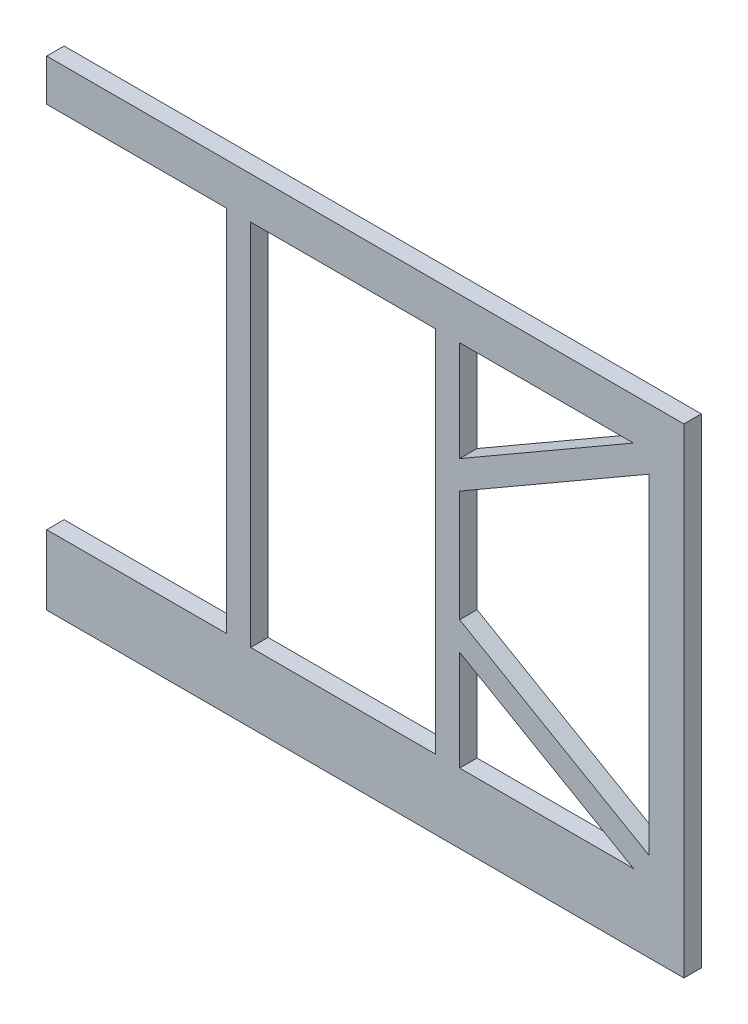
ISO-10303-21;
HEADER;
FILE_DESCRIPTION(('STEP AP214'),'2;1');
FILE_NAME('part.step','',(''),(''),'','','');
FILE_SCHEMA(('AUTOMOTIVE_DESIGN { 1 0 10303 214 1 1 1 1 }'));
ENDSEC;
DATA;
#1=APPLICATION_CONTEXT('core data for automotive mechanical design processes');
#2=APPLICATION_PROTOCOL_DEFINITION('international standard','automotive_design',2000,#1);
#3=PRODUCT_CONTEXT('',#1,'mechanical');
#4=PRODUCT('Part','Part','',(#3));
#5=PRODUCT_RELATED_PRODUCT_CATEGORY('part','',(#4));
#6=PRODUCT_DEFINITION_FORMATION('','',#4);
#7=PRODUCT_DEFINITION_CONTEXT('part definition',#1,'design');
#8=PRODUCT_DEFINITION('design','',#6,#7);
#9=PRODUCT_DEFINITION_SHAPE('','',#8);
#10=(LENGTH_UNIT() NAMED_UNIT(*) SI_UNIT(.MILLI.,.METRE.));
#11=(NAMED_UNIT(*) PLANE_ANGLE_UNIT() SI_UNIT($,.RADIAN.));
#12=(NAMED_UNIT(*) SI_UNIT($,.STERADIAN.) SOLID_ANGLE_UNIT());
#13=UNCERTAINTY_MEASURE_WITH_UNIT(LENGTH_MEASURE(1.E-05),#10,'distance_accuracy_value','');
#14=(GEOMETRIC_REPRESENTATION_CONTEXT(3) GLOBAL_UNCERTAINTY_ASSIGNED_CONTEXT((#13)) GLOBAL_UNIT_ASSIGNED_CONTEXT((#10,
#11,#12)) REPRESENTATION_CONTEXT('',''));
#15=CARTESIAN_POINT('',(0.,0.,0.));
#16=DIRECTION('',(0.,0.,1.));
#17=DIRECTION('',(1.,0.,0.));
#18=AXIS2_PLACEMENT_3D('',#15,#16,#17);
#19=CARTESIAN_POINT('',(0.,0.,5.));
#20=DIRECTION('',(0.,0.,-1.));
#21=DIRECTION('',(-1.,0.,0.));
#22=AXIS2_PLACEMENT_3D('',#19,#20,#21);
#23=PLANE('',#22);
#24=DIRECTION('',(0.,-1.,0.));
#25=VECTOR('',#24,1.);
#26=CARTESIAN_POINT('',(63.4999999999999,51.9,5.));
#27=LINE('',#26,#25);
#28=CARTESIAN_POINT('',(63.4999999999999,51.9,5.));
#29=VERTEX_POINT('',#28);
#30=CARTESIAN_POINT('',(63.4999999999999,23.0829037686548,5.));
#31=VERTEX_POINT('',#30);
#32=EDGE_CURVE('E226',#29,#31,#27,.T.);
#33=ORIENTED_EDGE('',*,*,#32,.F.);
#34=DIRECTION('',(-1.,0.,0.));
#35=VECTOR('',#34,1.);
#36=CARTESIAN_POINT('',(113.412674799291,51.9,5.));
#37=LINE('',#36,#35);
#38=CARTESIAN_POINT('',(113.412674799291,51.9,5.));
#39=VERTEX_POINT('',#38);
#40=EDGE_CURVE('E232',#39,#29,#37,.T.);
#41=ORIENTED_EDGE('',*,*,#40,.F.);
#42=DIRECTION('',(0.866025403784438,0.500000000000001,0.));
#43=VECTOR('',#42,1.);
#44=CARTESIAN_POINT('',(113.412674799291,51.9,5.));
#45=LINE('',#44,#43);
#46=EDGE_CURVE('E228',#31,#39,#45,.T.);
#47=ORIENTED_EDGE('',*,*,#46,.F.);
#48=EDGE_LOOP('',(#33,#41,#47));
#49=FACE_BOUND('',#48,.T.);
#50=DIRECTION('',(0.,1.,0.));
#51=VECTOR('',#50,1.);
#52=CARTESIAN_POINT('',(56.4999999999999,51.9,5.));
#53=LINE('',#52,#51);
#54=CARTESIAN_POINT('',(56.4999999999999,-53.9,5.));
#55=VERTEX_POINT('',#54);
#56=CARTESIAN_POINT('',(56.4999999999999,51.9,5.));
#57=VERTEX_POINT('',#56);
#58=EDGE_CURVE('E274',#55,#57,#53,.T.);
#59=ORIENTED_EDGE('',*,*,#58,.F.);
#60=DIRECTION('',(1.,0.,0.));
#61=VECTOR('',#60,1.);
#62=CARTESIAN_POINT('',(56.4999999999999,-53.9,5.));
#63=LINE('',#62,#61);
#64=CARTESIAN_POINT('',(3.5,-53.9,5.));
#65=VERTEX_POINT('',#64);
#66=EDGE_CURVE('E282',#65,#55,#63,.T.);
#67=ORIENTED_EDGE('',*,*,#66,.F.);
#68=DIRECTION('',(0.,-1.,0.));
#69=VECTOR('',#68,1.);
#70=CARTESIAN_POINT('',(3.49999999999999,51.9,5.));
#71=LINE('',#70,#69);
#72=CARTESIAN_POINT('',(3.49999999999999,51.9,5.));
#73=VERTEX_POINT('',#72);
#74=EDGE_CURVE('E279',#73,#65,#71,.T.);
#75=ORIENTED_EDGE('',*,*,#74,.F.);
#76=DIRECTION('',(-1.,0.,0.));
#77=VECTOR('',#76,1.);
#78=CARTESIAN_POINT('',(56.4999999999999,51.9,5.));
#79=LINE('',#78,#77);
#80=EDGE_CURVE('E276',#57,#73,#79,.T.);
#81=ORIENTED_EDGE('',*,*,#80,.F.);
#82=EDGE_LOOP('',(#59,#67,#75,#81));
#83=FACE_BOUND('',#82,.T.);
#84=DIRECTION('',(0.,1.,0.));
#85=VECTOR('',#84,1.);
#86=CARTESIAN_POINT('',(127.9,63.9,5.));
#87=LINE('',#86,#85);
#88=CARTESIAN_POINT('',(127.9,-73.9,5.));
#89=VERTEX_POINT('',#88);
#90=CARTESIAN_POINT('',(127.9,63.9,5.));
#91=VERTEX_POINT('',#90);
#92=EDGE_CURVE('E305',#89,#91,#87,.T.);
#93=ORIENTED_EDGE('',*,*,#92,.T.);
#94=DIRECTION('',(-1.,0.,0.));
#95=VECTOR('',#94,1.);
#96=CARTESIAN_POINT('',(127.9,63.9,5.));
#97=LINE('',#96,#95);
#98=CARTESIAN_POINT('',(-55.0824018937857,63.9,5.));
#99=VERTEX_POINT('',#98);
#100=EDGE_CURVE('E308',#91,#99,#97,.T.);
#101=ORIENTED_EDGE('',*,*,#100,.T.);
#102=DIRECTION('',(0.,-1.,0.));
#103=VECTOR('',#102,1.);
#104=CARTESIAN_POINT('',(-55.0824018937857,63.9,5.));
#105=LINE('',#104,#103);
#106=CARTESIAN_POINT('',(-55.0824018937857,51.9,5.));
#107=VERTEX_POINT('',#106);
#108=EDGE_CURVE('E311',#99,#107,#105,.T.);
#109=ORIENTED_EDGE('',*,*,#108,.T.);
#110=DIRECTION('',(1.,0.,0.));
#111=VECTOR('',#110,1.);
#112=CARTESIAN_POINT('',(-3.50000000000001,51.9,5.));
#113=LINE('',#112,#111);
#114=CARTESIAN_POINT('',(-3.50000000000001,51.9,5.));
#115=VERTEX_POINT('',#114);
#116=EDGE_CURVE('E313',#107,#115,#113,.T.);
#117=ORIENTED_EDGE('',*,*,#116,.T.);
#118=DIRECTION('',(0.,-1.,0.));
#119=VECTOR('',#118,1.);
#120=CARTESIAN_POINT('',(-3.50000000000001,51.9,5.));
#121=LINE('',#120,#119);
#122=CARTESIAN_POINT('',(-3.49999999999999,-53.9,5.));
#123=VERTEX_POINT('',#122);
#124=EDGE_CURVE('E315',#115,#123,#121,.T.);
#125=ORIENTED_EDGE('',*,*,#124,.T.);
#126=DIRECTION('',(-1.,0.,0.));
#127=VECTOR('',#126,1.);
#128=CARTESIAN_POINT('',(-3.49999999999999,-53.9,5.));
#129=LINE('',#128,#127);
#130=CARTESIAN_POINT('',(-55.0824018937857,-53.9,5.));
#131=VERTEX_POINT('',#130);
#132=EDGE_CURVE('E317',#123,#131,#129,.T.);
#133=ORIENTED_EDGE('',*,*,#132,.T.);
#134=DIRECTION('',(0.,-1.,0.));
#135=VECTOR('',#134,1.);
#136=CARTESIAN_POINT('',(-55.0824018937857,-53.9,5.));
#137=LINE('',#136,#135);
#138=CARTESIAN_POINT('',(-55.0824018937857,-73.9,5.));
#139=VERTEX_POINT('',#138);
#140=EDGE_CURVE('E319',#131,#139,#137,.T.);
#141=ORIENTED_EDGE('',*,*,#140,.T.);
#142=DIRECTION('',(1.,0.,0.));
#143=VECTOR('',#142,1.);
#144=CARTESIAN_POINT('',(127.9,-73.9,5.));
#145=LINE('',#144,#143);
#146=EDGE_CURVE('E321',#139,#89,#145,.T.);
#147=ORIENTED_EDGE('',*,*,#146,.T.);
#148=EDGE_LOOP('',(#93,#101,#109,#117,#125,#133,#141,#147));
#149=FACE_BOUND('',#148,.T.);
#150=DIRECTION('',(0.,-1.,0.));
#151=VECTOR('',#150,1.);
#152=CARTESIAN_POINT('',(63.4999999999999,-25.0829037686548,5.));
#153=LINE('',#152,#151);
#154=CARTESIAN_POINT('',(63.4999999999999,-25.0829037686548,5.));
#155=VERTEX_POINT('',#154);
#156=CARTESIAN_POINT('',(63.4999999999999,-53.9,5.));
#157=VERTEX_POINT('',#156);
#158=EDGE_CURVE('E250',#155,#157,#153,.T.);
#159=ORIENTED_EDGE('',*,*,#158,.F.);
#160=DIRECTION('',(-0.866025403784438,0.500000000000001,0.));
#161=VECTOR('',#160,1.);
#162=CARTESIAN_POINT('',(113.412674799291,-53.9,5.));
#163=LINE('',#162,#161);
#164=CARTESIAN_POINT('',(113.412674799291,-53.9,5.));
#165=VERTEX_POINT('',#164);
#166=EDGE_CURVE('E256',#165,#155,#163,.T.);
#167=ORIENTED_EDGE('',*,*,#166,.F.);
#168=DIRECTION('',(1.,0.,0.));
#169=VECTOR('',#168,1.);
#170=CARTESIAN_POINT('',(113.412674799291,-53.9,5.));
#171=LINE('',#170,#169);
#172=EDGE_CURVE('E252',#157,#165,#171,.T.);
#173=ORIENTED_EDGE('',*,*,#172,.F.);
#174=EDGE_LOOP('',(#159,#167,#173));
#175=FACE_BOUND('',#174,.T.);
#176=DIRECTION('',(0.,-1.,0.));
#177=VECTOR('',#176,1.);
#178=CARTESIAN_POINT('',(63.4999999999999,15.,5.));
#179=LINE('',#178,#177);
#180=CARTESIAN_POINT('',(63.4999999999999,15.,5.));
#181=VERTEX_POINT('',#180);
#182=CARTESIAN_POINT('',(63.4999999999999,-17.,5.));
#183=VERTEX_POINT('',#182);
#184=EDGE_CURVE('E190',#181,#183,#179,.T.);
#185=ORIENTED_EDGE('',*,*,#184,.F.);
#186=DIRECTION('',(-0.866025403784438,-0.500000000000001,0.));
#187=VECTOR('',#186,1.);
#188=CARTESIAN_POINT('',(117.9,46.4078546439158,5.));
#189=LINE('',#188,#187);
#190=CARTESIAN_POINT('',(117.9,46.4078546439158,5.));
#191=VERTEX_POINT('',#190);
#192=EDGE_CURVE('E212',#191,#181,#189,.T.);
#193=ORIENTED_EDGE('',*,*,#192,.F.);
#194=DIRECTION('',(0.,1.,0.));
#195=VECTOR('',#194,1.);
#196=CARTESIAN_POINT('',(117.9,46.4078546439158,5.));
#197=LINE('',#196,#195);
#198=CARTESIAN_POINT('',(117.9,-48.4078546439158,5.));
#199=VERTEX_POINT('',#198);
#200=EDGE_CURVE('E210',#199,#191,#197,.T.);
#201=ORIENTED_EDGE('',*,*,#200,.F.);
#202=DIRECTION('',(0.866025403784438,-0.500000000000001,0.));
#203=VECTOR('',#202,1.);
#204=CARTESIAN_POINT('',(63.4999999999999,-17.,5.));
#205=LINE('',#204,#203);
#206=EDGE_CURVE('E198',#183,#199,#205,.T.);
#207=ORIENTED_EDGE('',*,*,#206,.F.);
#208=EDGE_LOOP('',(#185,#193,#201,#207));
#209=FACE_BOUND('',#208,.T.);
#210=ADVANCED_FACE('F41',(#49,#83,#149,#175,#209),#23,.F.);
#211=CARTESIAN_POINT('',(0.,0.,0.));
#212=DIRECTION('',(0.,0.,-1.));
#213=DIRECTION('',(-1.,0.,0.));
#214=AXIS2_PLACEMENT_3D('',#211,#212,#213);
#215=PLANE('',#214);
#216=DIRECTION('',(-1.,0.,0.));
#217=VECTOR('',#216,1.);
#218=CARTESIAN_POINT('',(127.9,63.9,0.));
#219=LINE('',#218,#217);
#220=CARTESIAN_POINT('',(127.9,63.9,0.));
#221=VERTEX_POINT('',#220);
#222=CARTESIAN_POINT('',(-55.0824018937857,63.9,0.));
#223=VERTEX_POINT('',#222);
#224=EDGE_CURVE('E304',#221,#223,#219,.T.);
#225=ORIENTED_EDGE('',*,*,#224,.F.);
#226=DIRECTION('',(0.,1.,0.));
#227=VECTOR('',#226,1.);
#228=CARTESIAN_POINT('',(127.9,51.9,0.));
#229=LINE('',#228,#227);
#230=CARTESIAN_POINT('',(127.9,-73.9,0.));
#231=VERTEX_POINT('',#230);
#232=EDGE_CURVE('E309',#231,#221,#229,.T.);
#233=ORIENTED_EDGE('',*,*,#232,.F.);
#234=DIRECTION('',(1.,0.,0.));
#235=VECTOR('',#234,1.);
#236=CARTESIAN_POINT('',(127.9,-73.9,0.));
#237=LINE('',#236,#235);
#238=CARTESIAN_POINT('',(-55.0824018937857,-73.9,0.));
#239=VERTEX_POINT('',#238);
#240=EDGE_CURVE('E336',#239,#231,#237,.T.);
#241=ORIENTED_EDGE('',*,*,#240,.F.);
#242=DIRECTION('',(0.,-1.,0.));
#243=VECTOR('',#242,1.);
#244=CARTESIAN_POINT('',(-55.0824018937857,-53.9,0.));
#245=LINE('',#244,#243);
#246=CARTESIAN_POINT('',(-55.0824018937857,-53.9,0.));
#247=VERTEX_POINT('',#246);
#248=EDGE_CURVE('E334',#247,#239,#245,.T.);
#249=ORIENTED_EDGE('',*,*,#248,.F.);
#250=DIRECTION('',(-1.,0.,0.));
#251=VECTOR('',#250,1.);
#252=CARTESIAN_POINT('',(-3.49999999999999,-53.9,0.));
#253=LINE('',#252,#251);
#254=CARTESIAN_POINT('',(-3.49999999999999,-53.9,0.));
#255=VERTEX_POINT('',#254);
#256=EDGE_CURVE('E332',#255,#247,#253,.T.);
#257=ORIENTED_EDGE('',*,*,#256,.F.);
#258=DIRECTION('',(0.,-1.,0.));
#259=VECTOR('',#258,1.);
#260=CARTESIAN_POINT('',(-3.50000000000001,51.9,0.));
#261=LINE('',#260,#259);
#262=CARTESIAN_POINT('',(-3.50000000000001,51.9,0.));
#263=VERTEX_POINT('',#262);
#264=EDGE_CURVE('E330',#263,#255,#261,.T.);
#265=ORIENTED_EDGE('',*,*,#264,.F.);
#266=DIRECTION('',(1.,0.,0.));
#267=VECTOR('',#266,1.);
#268=CARTESIAN_POINT('',(-3.50000000000001,51.9,0.));
#269=LINE('',#268,#267);
#270=CARTESIAN_POINT('',(-55.0824018937857,51.9,0.));
#271=VERTEX_POINT('',#270);
#272=EDGE_CURVE('E328',#271,#263,#269,.T.);
#273=ORIENTED_EDGE('',*,*,#272,.F.);
#274=DIRECTION('',(0.,-1.,0.));
#275=VECTOR('',#274,1.);
#276=CARTESIAN_POINT('',(-55.0824018937857,63.9,0.));
#277=LINE('',#276,#275);
#278=EDGE_CURVE('E326',#223,#271,#277,.T.);
#279=ORIENTED_EDGE('',*,*,#278,.F.);
#280=EDGE_LOOP('',(#225,#233,#241,#249,#257,#265,#273,#279));
#281=FACE_BOUND('',#280,.T.);
#282=DIRECTION('',(1.,0.,0.));
#283=VECTOR('',#282,1.);
#284=CARTESIAN_POINT('',(56.4999999999999,-53.9,0.));
#285=LINE('',#284,#283);
#286=CARTESIAN_POINT('',(3.5,-53.9,0.));
#287=VERTEX_POINT('',#286);
#288=CARTESIAN_POINT('',(56.4999999999999,-53.9,0.));
#289=VERTEX_POINT('',#288);
#290=EDGE_CURVE('E277',#287,#289,#285,.T.);
#291=ORIENTED_EDGE('',*,*,#290,.T.);
#292=DIRECTION('',(0.,1.,0.));
#293=VECTOR('',#292,1.);
#294=CARTESIAN_POINT('',(56.4999999999999,51.9,0.));
#295=LINE('',#294,#293);
#296=CARTESIAN_POINT('',(56.4999999999999,51.9,0.));
#297=VERTEX_POINT('',#296);
#298=EDGE_CURVE('E273',#289,#297,#295,.T.);
#299=ORIENTED_EDGE('',*,*,#298,.T.);
#300=DIRECTION('',(-1.,0.,0.));
#301=VECTOR('',#300,1.);
#302=CARTESIAN_POINT('',(56.4999999999999,51.9,0.));
#303=LINE('',#302,#301);
#304=CARTESIAN_POINT('',(3.49999999999999,51.9,0.));
#305=VERTEX_POINT('',#304);
#306=EDGE_CURVE('E287',#297,#305,#303,.T.);
#307=ORIENTED_EDGE('',*,*,#306,.T.);
#308=DIRECTION('',(0.,-1.,0.));
#309=VECTOR('',#308,1.);
#310=CARTESIAN_POINT('',(3.49999999999999,51.9,0.));
#311=LINE('',#310,#309);
#312=EDGE_CURVE('E290',#305,#287,#311,.T.);
#313=ORIENTED_EDGE('',*,*,#312,.T.);
#314=EDGE_LOOP('',(#291,#299,#307,#313));
#315=FACE_BOUND('',#314,.T.);
#316=DIRECTION('',(-0.866025403784438,0.500000000000001,0.));
#317=VECTOR('',#316,1.);
#318=CARTESIAN_POINT('',(113.412674799291,-53.9,0.));
#319=LINE('',#318,#317);
#320=CARTESIAN_POINT('',(113.412674799291,-53.9,0.));
#321=VERTEX_POINT('',#320);
#322=CARTESIAN_POINT('',(63.4999999999999,-25.0829037686548,0.));
#323=VERTEX_POINT('',#322);
#324=EDGE_CURVE('E253',#321,#323,#319,.T.);
#325=ORIENTED_EDGE('',*,*,#324,.T.);
#326=DIRECTION('',(0.,-1.,0.));
#327=VECTOR('',#326,1.);
#328=CARTESIAN_POINT('',(63.4999999999999,-25.0829037686548,0.));
#329=LINE('',#328,#327);
#330=CARTESIAN_POINT('',(63.4999999999999,-53.9,0.));
#331=VERTEX_POINT('',#330);
#332=EDGE_CURVE('E249',#323,#331,#329,.T.);
#333=ORIENTED_EDGE('',*,*,#332,.T.);
#334=DIRECTION('',(1.,0.,0.));
#335=VECTOR('',#334,1.);
#336=CARTESIAN_POINT('',(113.412674799291,-53.9,0.));
#337=LINE('',#336,#335);
#338=EDGE_CURVE('E261',#331,#321,#337,.T.);
#339=ORIENTED_EDGE('',*,*,#338,.T.);
#340=EDGE_LOOP('',(#325,#333,#339));
#341=FACE_BOUND('',#340,.T.);
#342=DIRECTION('',(-1.,0.,0.));
#343=VECTOR('',#342,1.);
#344=CARTESIAN_POINT('',(113.412674799291,51.9,0.));
#345=LINE('',#344,#343);
#346=CARTESIAN_POINT('',(113.412674799291,51.9,0.));
#347=VERTEX_POINT('',#346);
#348=CARTESIAN_POINT('',(63.4999999999999,51.9,0.));
#349=VERTEX_POINT('',#348);
#350=EDGE_CURVE('E229',#347,#349,#345,.T.);
#351=ORIENTED_EDGE('',*,*,#350,.T.);
#352=DIRECTION('',(0.,-1.,0.));
#353=VECTOR('',#352,1.);
#354=CARTESIAN_POINT('',(63.4999999999999,51.9,0.));
#355=LINE('',#354,#353);
#356=CARTESIAN_POINT('',(63.4999999999999,23.0829037686548,0.));
#357=VERTEX_POINT('',#356);
#358=EDGE_CURVE('E206',#349,#357,#355,.T.);
#359=ORIENTED_EDGE('',*,*,#358,.T.);
#360=DIRECTION('',(0.866025403784438,0.500000000000001,0.));
#361=VECTOR('',#360,1.);
#362=CARTESIAN_POINT('',(113.412674799291,51.9,0.));
#363=LINE('',#362,#361);
#364=EDGE_CURVE('E237',#357,#347,#363,.T.);
#365=ORIENTED_EDGE('',*,*,#364,.T.);
#366=EDGE_LOOP('',(#351,#359,#365));
#367=FACE_BOUND('',#366,.T.);
#368=DIRECTION('',(-0.866025403784438,-0.500000000000001,0.));
#369=VECTOR('',#368,1.);
#370=CARTESIAN_POINT('',(117.9,46.4078546439158,0.));
#371=LINE('',#370,#369);
#372=CARTESIAN_POINT('',(117.9,46.4078546439158,0.));
#373=VERTEX_POINT('',#372);
#374=CARTESIAN_POINT('',(63.4999999999999,15.,0.));
#375=VERTEX_POINT('',#374);
#376=EDGE_CURVE('E199',#373,#375,#371,.T.);
#377=ORIENTED_EDGE('',*,*,#376,.T.);
#378=DIRECTION('',(0.,-1.,0.));
#379=VECTOR('',#378,1.);
#380=CARTESIAN_POINT('',(63.4999999999999,15.,0.));
#381=LINE('',#380,#379);
#382=CARTESIAN_POINT('',(63.4999999999999,-17.,0.));
#383=VERTEX_POINT('',#382);
#384=EDGE_CURVE('E64',#375,#383,#381,.T.);
#385=ORIENTED_EDGE('',*,*,#384,.T.);
#386=DIRECTION('',(0.866025403784438,-0.500000000000001,0.));
#387=VECTOR('',#386,1.);
#388=CARTESIAN_POINT('',(63.4999999999999,-17.,0.));
#389=LINE('',#388,#387);
#390=CARTESIAN_POINT('',(117.9,-48.4078546439158,0.));
#391=VERTEX_POINT('',#390);
#392=EDGE_CURVE('E205',#383,#391,#389,.T.);
#393=ORIENTED_EDGE('',*,*,#392,.T.);
#394=DIRECTION('',(0.,1.,0.));
#395=VECTOR('',#394,1.);
#396=CARTESIAN_POINT('',(117.9,46.4078546439158,0.));
#397=LINE('',#396,#395);
#398=EDGE_CURVE('E218',#391,#373,#397,.T.);
#399=ORIENTED_EDGE('',*,*,#398,.T.);
#400=EDGE_LOOP('',(#377,#385,#393,#399));
#401=FACE_BOUND('',#400,.T.);
#402=ADVANCED_FACE('F366',(#281,#315,#341,#367,#401),#215,.T.);
#403=CARTESIAN_POINT('',(127.9,63.9,5.));
#404=DIRECTION('',(0.,-1.,0.));
#405=DIRECTION('',(1.,0.,0.));
#406=AXIS2_PLACEMENT_3D('',#403,#404,#405);
#407=PLANE('',#406);
#408=ORIENTED_EDGE('',*,*,#224,.T.);
#409=DIRECTION('',(0.,0.,-1.));
#410=VECTOR('',#409,1.);
#411=CARTESIAN_POINT('',(-55.0824018937857,63.9,5.));
#412=LINE('',#411,#410);
#413=EDGE_CURVE('E49',#99,#223,#412,.T.);
#414=ORIENTED_EDGE('',*,*,#413,.F.);
#415=ORIENTED_EDGE('',*,*,#100,.F.);
#416=DIRECTION('',(0.,0.,-1.));
#417=VECTOR('',#416,1.);
#418=CARTESIAN_POINT('',(127.9,63.9,5.));
#419=LINE('',#418,#417);
#420=EDGE_CURVE('E11',#91,#221,#419,.T.);
#421=ORIENTED_EDGE('',*,*,#420,.T.);
#422=EDGE_LOOP('',(#408,#414,#415,#421));
#423=FACE_BOUND('',#422,.T.);
#424=ADVANCED_FACE('F43',(#423),#407,.F.);
#425=CARTESIAN_POINT('',(-55.0824018937857,63.9,5.));
#426=DIRECTION('',(1.,0.,0.));
#427=DIRECTION('',(0.,0.,-1.));
#428=AXIS2_PLACEMENT_3D('',#425,#426,#427);
#429=PLANE('',#428);
#430=ORIENTED_EDGE('',*,*,#278,.T.);
#431=DIRECTION('',(0.,0.,-1.));
#432=VECTOR('',#431,1.);
#433=CARTESIAN_POINT('',(-55.0824018937857,51.9,5.));
#434=LINE('',#433,#432);
#435=EDGE_CURVE('E353',#107,#271,#434,.T.);
#436=ORIENTED_EDGE('',*,*,#435,.F.);
#437=ORIENTED_EDGE('',*,*,#108,.F.);
#438=ORIENTED_EDGE('',*,*,#413,.T.);
#439=EDGE_LOOP('',(#430,#436,#437,#438));
#440=FACE_BOUND('',#439,.T.);
#441=ADVANCED_FACE('F360',(#440),#429,.F.);
#442=CARTESIAN_POINT('',(-3.50000000000001,51.9,5.));
#443=DIRECTION('',(0.,1.,0.));
#444=DIRECTION('',(-1.,0.,0.));
#445=AXIS2_PLACEMENT_3D('',#442,#443,#444);
#446=PLANE('',#445);
#447=ORIENTED_EDGE('',*,*,#272,.T.);
#448=DIRECTION('',(0.,0.,-1.));
#449=VECTOR('',#448,1.);
#450=CARTESIAN_POINT('',(-3.50000000000001,51.9,5.));
#451=LINE('',#450,#449);
#452=EDGE_CURVE('E350',#115,#263,#451,.T.);
#453=ORIENTED_EDGE('',*,*,#452,.F.);
#454=ORIENTED_EDGE('',*,*,#116,.F.);
#455=ORIENTED_EDGE('',*,*,#435,.T.);
#456=EDGE_LOOP('',(#447,#453,#454,#455));
#457=FACE_BOUND('',#456,.T.);
#458=ADVANCED_FACE('F373',(#457),#446,.F.);
#459=CARTESIAN_POINT('',(-3.50000000000001,51.9,5.));
#460=DIRECTION('',(1.,0.,0.));
#461=DIRECTION('',(0.,1.,0.));
#462=AXIS2_PLACEMENT_3D('',#459,#460,#461);
#463=PLANE('',#462);
#464=ORIENTED_EDGE('',*,*,#264,.T.);
#465=DIRECTION('',(0.,0.,-1.));
#466=VECTOR('',#465,1.);
#467=CARTESIAN_POINT('',(-3.49999999999999,-53.9,5.));
#468=LINE('',#467,#466);
#469=EDGE_CURVE('E347',#123,#255,#468,.T.);
#470=ORIENTED_EDGE('',*,*,#469,.F.);
#471=ORIENTED_EDGE('',*,*,#124,.F.);
#472=ORIENTED_EDGE('',*,*,#452,.T.);
#473=EDGE_LOOP('',(#464,#470,#471,#472));
#474=FACE_BOUND('',#473,.T.);
#475=ADVANCED_FACE('F377',(#474),#463,.F.);
#476=CARTESIAN_POINT('',(-3.49999999999999,-53.9,5.));
#477=DIRECTION('',(0.,-1.,0.));
#478=DIRECTION('',(1.,0.,0.));
#479=AXIS2_PLACEMENT_3D('',#476,#477,#478);
#480=PLANE('',#479);
#481=ORIENTED_EDGE('',*,*,#256,.T.);
#482=DIRECTION('',(0.,0.,-1.));
#483=VECTOR('',#482,1.);
#484=CARTESIAN_POINT('',(-55.0824018937857,-53.9,5.));
#485=LINE('',#484,#483);
#486=EDGE_CURVE('E344',#131,#247,#485,.T.);
#487=ORIENTED_EDGE('',*,*,#486,.F.);
#488=ORIENTED_EDGE('',*,*,#132,.F.);
#489=ORIENTED_EDGE('',*,*,#469,.T.);
#490=EDGE_LOOP('',(#481,#487,#488,#489));
#491=FACE_BOUND('',#490,.T.);
#492=ADVANCED_FACE('F397',(#491),#480,.F.);
#493=CARTESIAN_POINT('',(-55.0824018937857,-53.9,5.));
#494=DIRECTION('',(1.,0.,0.));
#495=DIRECTION('',(0.,0.,-1.));
#496=AXIS2_PLACEMENT_3D('',#493,#494,#495);
#497=PLANE('',#496);
#498=ORIENTED_EDGE('',*,*,#248,.T.);
#499=DIRECTION('',(0.,0.,-1.));
#500=VECTOR('',#499,1.);
#501=CARTESIAN_POINT('',(-55.0824018937857,-73.9,5.));
#502=LINE('',#501,#500);
#503=EDGE_CURVE('E341',#139,#239,#502,.T.);
#504=ORIENTED_EDGE('',*,*,#503,.F.);
#505=ORIENTED_EDGE('',*,*,#140,.F.);
#506=ORIENTED_EDGE('',*,*,#486,.T.);
#507=EDGE_LOOP('',(#498,#504,#505,#506));
#508=FACE_BOUND('',#507,.T.);
#509=ADVANCED_FACE('F395',(#508),#497,.F.);
#510=CARTESIAN_POINT('',(127.9,-73.9,5.));
#511=DIRECTION('',(0.,1.,0.));
#512=DIRECTION('',(-1.,0.,0.));
#513=AXIS2_PLACEMENT_3D('',#510,#511,#512);
#514=PLANE('',#513);
#515=ORIENTED_EDGE('',*,*,#240,.T.);
#516=DIRECTION('',(0.,0.,-1.));
#517=VECTOR('',#516,1.);
#518=CARTESIAN_POINT('',(127.9,-73.9,5.));
#519=LINE('',#518,#517);
#520=EDGE_CURVE('E324',#89,#231,#519,.T.);
#521=ORIENTED_EDGE('',*,*,#520,.F.);
#522=ORIENTED_EDGE('',*,*,#146,.F.);
#523=ORIENTED_EDGE('',*,*,#503,.T.);
#524=EDGE_LOOP('',(#515,#521,#522,#523));
#525=FACE_BOUND('',#524,.T.);
#526=ADVANCED_FACE('F390',(#525),#514,.F.);
#527=CARTESIAN_POINT('',(127.9,51.9,5.));
#528=DIRECTION('',(-1.,0.,0.));
#529=DIRECTION('',(0.,0.,1.));
#530=AXIS2_PLACEMENT_3D('',#527,#528,#529);
#531=PLANE('',#530);
#532=ORIENTED_EDGE('',*,*,#232,.T.);
#533=ORIENTED_EDGE('',*,*,#420,.F.);
#534=ORIENTED_EDGE('',*,*,#92,.F.);
#535=ORIENTED_EDGE('',*,*,#520,.T.);
#536=EDGE_LOOP('',(#532,#533,#534,#535));
#537=FACE_BOUND('',#536,.T.);
#538=ADVANCED_FACE('F385',(#537),#531,.F.);
#539=CARTESIAN_POINT('',(56.4999999999999,51.9,5.));
#540=DIRECTION('',(-1.,0.,0.));
#541=DIRECTION('',(0.,-1.,0.));
#542=AXIS2_PLACEMENT_3D('',#539,#540,#541);
#543=PLANE('',#542);
#544=ORIENTED_EDGE('',*,*,#298,.F.);
#545=DIRECTION('',(0.,0.,-1.));
#546=VECTOR('',#545,1.);
#547=CARTESIAN_POINT('',(56.4999999999999,-53.9,5.));
#548=LINE('',#547,#546);
#549=EDGE_CURVE('E284',#55,#289,#548,.T.);
#550=ORIENTED_EDGE('',*,*,#549,.F.);
#551=ORIENTED_EDGE('',*,*,#58,.T.);
#552=DIRECTION('',(0.,0.,-1.));
#553=VECTOR('',#552,1.);
#554=CARTESIAN_POINT('',(56.4999999999999,51.9,5.));
#555=LINE('',#554,#553);
#556=EDGE_CURVE('E301',#57,#297,#555,.T.);
#557=ORIENTED_EDGE('',*,*,#556,.T.);
#558=EDGE_LOOP('',(#544,#550,#551,#557));
#559=FACE_BOUND('',#558,.T.);
#560=ADVANCED_FACE('F416',(#559),#543,.T.);
#561=CARTESIAN_POINT('',(56.4999999999999,51.9,5.));
#562=DIRECTION('',(0.,-1.,0.));
#563=DIRECTION('',(1.,0.,0.));
#564=AXIS2_PLACEMENT_3D('',#561,#562,#563);
#565=PLANE('',#564);
#566=ORIENTED_EDGE('',*,*,#306,.F.);
#567=ORIENTED_EDGE('',*,*,#556,.F.);
#568=ORIENTED_EDGE('',*,*,#80,.T.);
#569=DIRECTION('',(0.,0.,-1.));
#570=VECTOR('',#569,1.);
#571=CARTESIAN_POINT('',(3.49999999999999,51.9,5.));
#572=LINE('',#571,#570);
#573=EDGE_CURVE('E299',#73,#305,#572,.T.);
#574=ORIENTED_EDGE('',*,*,#573,.T.);
#575=EDGE_LOOP('',(#566,#567,#568,#574));
#576=FACE_BOUND('',#575,.T.);
#577=ADVANCED_FACE('F438',(#576),#565,.T.);
#578=CARTESIAN_POINT('',(3.49999999999999,51.9,5.));
#579=DIRECTION('',(1.,0.,0.));
#580=DIRECTION('',(0.,1.,0.));
#581=AXIS2_PLACEMENT_3D('',#578,#579,#580);
#582=PLANE('',#581);
#583=ORIENTED_EDGE('',*,*,#312,.F.);
#584=ORIENTED_EDGE('',*,*,#573,.F.);
#585=ORIENTED_EDGE('',*,*,#74,.T.);
#586=DIRECTION('',(0.,0.,-1.));
#587=VECTOR('',#586,1.);
#588=CARTESIAN_POINT('',(3.5,-53.9,5.));
#589=LINE('',#588,#587);
#590=EDGE_CURVE('E297',#65,#287,#589,.T.);
#591=ORIENTED_EDGE('',*,*,#590,.T.);
#592=EDGE_LOOP('',(#583,#584,#585,#591));
#593=FACE_BOUND('',#592,.T.);
#594=ADVANCED_FACE('F446',(#593),#582,.T.);
#595=CARTESIAN_POINT('',(56.4999999999999,-53.9,5.));
#596=DIRECTION('',(0.,1.,0.));
#597=DIRECTION('',(-1.,0.,0.));
#598=AXIS2_PLACEMENT_3D('',#595,#596,#597);
#599=PLANE('',#598);
#600=ORIENTED_EDGE('',*,*,#290,.F.);
#601=ORIENTED_EDGE('',*,*,#590,.F.);
#602=ORIENTED_EDGE('',*,*,#66,.T.);
#603=ORIENTED_EDGE('',*,*,#549,.T.);
#604=EDGE_LOOP('',(#600,#601,#602,#603));
#605=FACE_BOUND('',#604,.T.);
#606=ADVANCED_FACE('F454',(#605),#599,.T.);
#607=CARTESIAN_POINT('',(63.4999999999999,-25.0829037686548,5.));
#608=DIRECTION('',(1.,0.,0.));
#609=DIRECTION('',(0.,1.,0.));
#610=AXIS2_PLACEMENT_3D('',#607,#608,#609);
#611=PLANE('',#610);
#612=ORIENTED_EDGE('',*,*,#332,.F.);
#613=DIRECTION('',(0.,0.,-1.));
#614=VECTOR('',#613,1.);
#615=CARTESIAN_POINT('',(63.4999999999999,-25.0829037686548,5.));
#616=LINE('',#615,#614);
#617=EDGE_CURVE('E258',#155,#323,#616,.T.);
#618=ORIENTED_EDGE('',*,*,#617,.F.);
#619=ORIENTED_EDGE('',*,*,#158,.T.);
#620=DIRECTION('',(0.,0.,-1.));
#621=VECTOR('',#620,1.);
#622=CARTESIAN_POINT('',(63.4999999999999,-53.9,5.));
#623=LINE('',#622,#621);
#624=EDGE_CURVE('E270',#157,#331,#623,.T.);
#625=ORIENTED_EDGE('',*,*,#624,.T.);
#626=EDGE_LOOP('',(#612,#618,#619,#625));
#627=FACE_BOUND('',#626,.T.);
#628=ADVANCED_FACE('F463',(#627),#611,.T.);
#629=CARTESIAN_POINT('',(113.412674799291,-53.9,5.));
#630=DIRECTION('',(0.,1.,0.));
#631=DIRECTION('',(-1.,0.,0.));
#632=AXIS2_PLACEMENT_3D('',#629,#630,#631);
#633=PLANE('',#632);
#634=ORIENTED_EDGE('',*,*,#338,.F.);
#635=ORIENTED_EDGE('',*,*,#624,.F.);
#636=ORIENTED_EDGE('',*,*,#172,.T.);
#637=DIRECTION('',(0.,0.,-1.));
#638=VECTOR('',#637,1.);
#639=CARTESIAN_POINT('',(113.412674799291,-53.9,5.));
#640=LINE('',#639,#638);
#641=EDGE_CURVE('E268',#165,#321,#640,.T.);
#642=ORIENTED_EDGE('',*,*,#641,.T.);
#643=EDGE_LOOP('',(#634,#635,#636,#642));
#644=FACE_BOUND('',#643,.T.);
#645=ADVANCED_FACE('F472',(#644),#633,.T.);
#646=CARTESIAN_POINT('',(113.412674799291,-53.9,5.));
#647=DIRECTION('',(-0.500000000000001,-0.866025403784438,0.));
#648=DIRECTION('',(0.866025403784438,-0.500000000000001,0.));
#649=AXIS2_PLACEMENT_3D('',#646,#647,#648);
#650=PLANE('',#649);
#651=ORIENTED_EDGE('',*,*,#324,.F.);
#652=ORIENTED_EDGE('',*,*,#641,.F.);
#653=ORIENTED_EDGE('',*,*,#166,.T.);
#654=ORIENTED_EDGE('',*,*,#617,.T.);
#655=EDGE_LOOP('',(#651,#652,#653,#654));
#656=FACE_BOUND('',#655,.T.);
#657=ADVANCED_FACE('F481',(#656),#650,.T.);
#658=CARTESIAN_POINT('',(63.4999999999999,51.9,5.));
#659=DIRECTION('',(1.,0.,0.));
#660=DIRECTION('',(0.,1.,0.));
#661=AXIS2_PLACEMENT_3D('',#658,#659,#660);
#662=PLANE('',#661);
#663=ORIENTED_EDGE('',*,*,#358,.F.);
#664=DIRECTION('',(0.,0.,-1.));
#665=VECTOR('',#664,1.);
#666=CARTESIAN_POINT('',(63.4999999999999,51.9,5.));
#667=LINE('',#666,#665);
#668=EDGE_CURVE('E234',#29,#349,#667,.T.);
#669=ORIENTED_EDGE('',*,*,#668,.F.);
#670=ORIENTED_EDGE('',*,*,#32,.T.);
#671=DIRECTION('',(0.,0.,-1.));
#672=VECTOR('',#671,1.);
#673=CARTESIAN_POINT('',(63.4999999999999,23.0829037686548,5.));
#674=LINE('',#673,#672);
#675=EDGE_CURVE('E246',#31,#357,#674,.T.);
#676=ORIENTED_EDGE('',*,*,#675,.T.);
#677=EDGE_LOOP('',(#663,#669,#670,#676));
#678=FACE_BOUND('',#677,.T.);
#679=ADVANCED_FACE('F490',(#678),#662,.T.);
#680=CARTESIAN_POINT('',(113.412674799291,51.9,5.));
#681=DIRECTION('',(-0.500000000000001,0.866025403784438,0.));
#682=DIRECTION('',(-0.866025403784438,-0.500000000000001,0.));
#683=AXIS2_PLACEMENT_3D('',#680,#681,#682);
#684=PLANE('',#683);
#685=ORIENTED_EDGE('',*,*,#364,.F.);
#686=ORIENTED_EDGE('',*,*,#675,.F.);
#687=ORIENTED_EDGE('',*,*,#46,.T.);
#688=DIRECTION('',(0.,0.,-1.));
#689=VECTOR('',#688,1.);
#690=CARTESIAN_POINT('',(113.412674799291,51.9,5.));
#691=LINE('',#690,#689);
#692=EDGE_CURVE('E244',#39,#347,#691,.T.);
#693=ORIENTED_EDGE('',*,*,#692,.T.);
#694=EDGE_LOOP('',(#685,#686,#687,#693));
#695=FACE_BOUND('',#694,.T.);
#696=ADVANCED_FACE('F499',(#695),#684,.T.);
#697=CARTESIAN_POINT('',(113.412674799291,51.9,5.));
#698=DIRECTION('',(0.,-1.,0.));
#699=DIRECTION('',(1.,0.,0.));
#700=AXIS2_PLACEMENT_3D('',#697,#698,#699);
#701=PLANE('',#700);
#702=ORIENTED_EDGE('',*,*,#350,.F.);
#703=ORIENTED_EDGE('',*,*,#692,.F.);
#704=ORIENTED_EDGE('',*,*,#40,.T.);
#705=ORIENTED_EDGE('',*,*,#668,.T.);
#706=EDGE_LOOP('',(#702,#703,#704,#705));
#707=FACE_BOUND('',#706,.T.);
#708=ADVANCED_FACE('F508',(#707),#701,.T.);
#709=CARTESIAN_POINT('',(63.4999999999999,15.,5.));
#710=DIRECTION('',(1.,0.,0.));
#711=DIRECTION('',(0.,1.,0.));
#712=AXIS2_PLACEMENT_3D('',#709,#710,#711);
#713=PLANE('',#712);
#714=ORIENTED_EDGE('',*,*,#384,.F.);
#715=DIRECTION('',(0.,0.,-1.));
#716=VECTOR('',#715,1.);
#717=CARTESIAN_POINT('',(63.4999999999999,15.,5.));
#718=LINE('',#717,#716);
#719=EDGE_CURVE('E194',#181,#375,#718,.T.);
#720=ORIENTED_EDGE('',*,*,#719,.F.);
#721=ORIENTED_EDGE('',*,*,#184,.T.);
#722=DIRECTION('',(0.,0.,-1.));
#723=VECTOR('',#722,1.);
#724=CARTESIAN_POINT('',(63.4999999999999,-17.,5.));
#725=LINE('',#724,#723);
#726=EDGE_CURVE('E193',#183,#383,#725,.T.);
#727=ORIENTED_EDGE('',*,*,#726,.T.);
#728=EDGE_LOOP('',(#714,#720,#721,#727));
#729=FACE_BOUND('',#728,.T.);
#730=ADVANCED_FACE('F192',(#729),#713,.T.);
#731=CARTESIAN_POINT('',(63.4999999999999,-17.,5.));
#732=DIRECTION('',(0.500000000000001,0.866025403784438,0.));
#733=DIRECTION('',(-0.866025403784438,0.500000000000001,0.));
#734=AXIS2_PLACEMENT_3D('',#731,#732,#733);
#735=PLANE('',#734);
#736=ORIENTED_EDGE('',*,*,#392,.F.);
#737=ORIENTED_EDGE('',*,*,#726,.F.);
#738=ORIENTED_EDGE('',*,*,#206,.T.);
#739=DIRECTION('',(0.,0.,-1.));
#740=VECTOR('',#739,1.);
#741=CARTESIAN_POINT('',(117.9,-48.4078546439158,5.));
#742=LINE('',#741,#740);
#743=EDGE_CURVE('E207',#199,#391,#742,.T.);
#744=ORIENTED_EDGE('',*,*,#743,.T.);
#745=EDGE_LOOP('',(#736,#737,#738,#744));
#746=FACE_BOUND('',#745,.T.);
#747=ADVANCED_FACE('F202',(#746),#735,.T.);
#748=CARTESIAN_POINT('',(117.9,46.4078546439158,5.));
#749=DIRECTION('',(-1.,0.,0.));
#750=DIRECTION('',(0.,-1.,0.));
#751=AXIS2_PLACEMENT_3D('',#748,#749,#750);
#752=PLANE('',#751);
#753=ORIENTED_EDGE('',*,*,#398,.F.);
#754=ORIENTED_EDGE('',*,*,#743,.F.);
#755=ORIENTED_EDGE('',*,*,#200,.T.);
#756=DIRECTION('',(0.,0.,-1.));
#757=VECTOR('',#756,1.);
#758=CARTESIAN_POINT('',(117.9,46.4078546439158,5.));
#759=LINE('',#758,#757);
#760=EDGE_CURVE('E56',#191,#373,#759,.T.);
#761=ORIENTED_EDGE('',*,*,#760,.T.);
#762=EDGE_LOOP('',(#753,#754,#755,#761));
#763=FACE_BOUND('',#762,.T.);
#764=ADVANCED_FACE('F532',(#763),#752,.T.);
#765=CARTESIAN_POINT('',(117.9,46.4078546439158,5.));
#766=DIRECTION('',(0.500000000000001,-0.866025403784438,0.));
#767=DIRECTION('',(0.866025403784438,0.500000000000001,0.));
#768=AXIS2_PLACEMENT_3D('',#765,#766,#767);
#769=PLANE('',#768);
#770=ORIENTED_EDGE('',*,*,#376,.F.);
#771=ORIENTED_EDGE('',*,*,#760,.F.);
#772=ORIENTED_EDGE('',*,*,#192,.T.);
#773=ORIENTED_EDGE('',*,*,#719,.T.);
#774=EDGE_LOOP('',(#770,#771,#772,#773));
#775=FACE_BOUND('',#774,.T.);
#776=ADVANCED_FACE('F540',(#775),#769,.T.);
#777=CLOSED_SHELL('',(#210,#402,#424,#441,#458,#475,#492,#509,#526,#538,#560,#577,#594,#606,
#628,#645,#657,#679,#696,#708,#730,#747,#764,#776));
#778=MANIFOLD_SOLID_BREP('B2',#777);
#779=ADVANCED_BREP_SHAPE_REPRESENTATION('',(#18,#778),#14);
#780=SHAPE_DEFINITION_REPRESENTATION(#9,#779);
ENDSEC;
END-ISO-10303-21;
